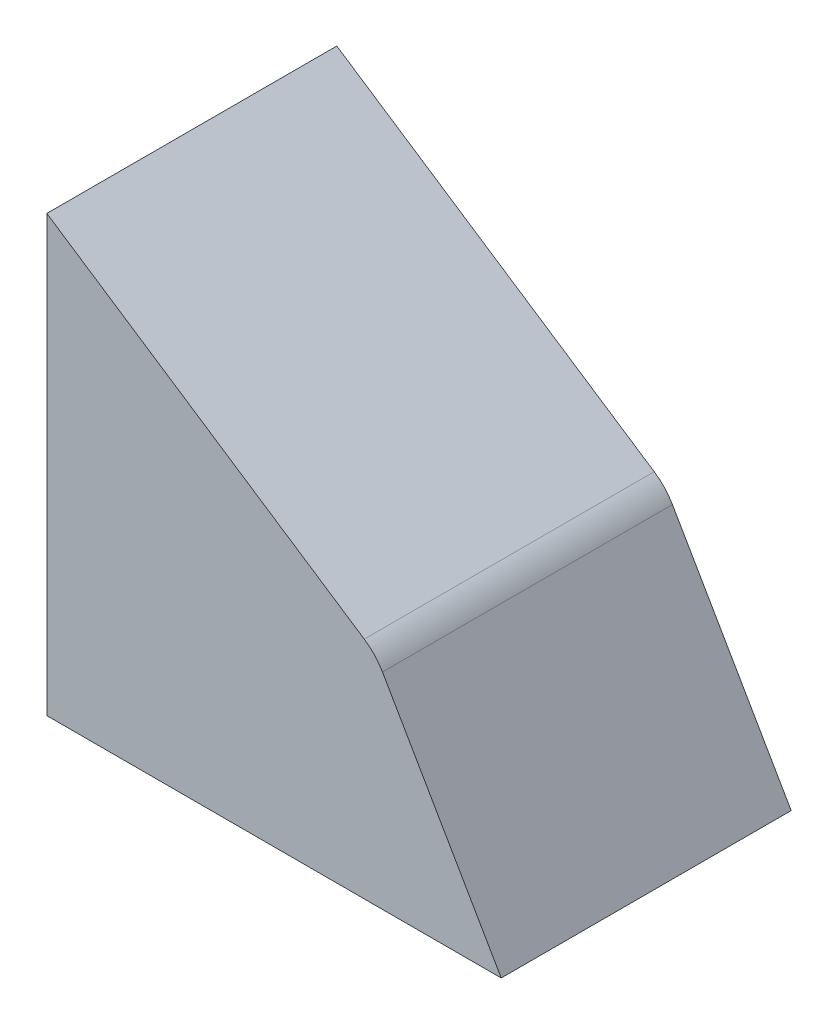
ISO-10303-21;
HEADER;
FILE_DESCRIPTION(('STEP AP214'),'2;1');
FILE_NAME('part.step','',(''),(''),'','','');
FILE_SCHEMA(('AUTOMOTIVE_DESIGN { 1 0 10303 214 1 1 1 1 }'));
ENDSEC;
DATA;
#1=APPLICATION_CONTEXT('core data for automotive mechanical design processes');
#2=APPLICATION_PROTOCOL_DEFINITION('international standard','automotive_design',2000,#1);
#3=PRODUCT_CONTEXT('',#1,'mechanical');
#4=PRODUCT('Part','Part','',(#3));
#5=PRODUCT_RELATED_PRODUCT_CATEGORY('part','',(#4));
#6=PRODUCT_DEFINITION_FORMATION('','',#4);
#7=PRODUCT_DEFINITION_CONTEXT('part definition',#1,'design');
#8=PRODUCT_DEFINITION('design','',#6,#7);
#9=PRODUCT_DEFINITION_SHAPE('','',#8);
#10=(LENGTH_UNIT() NAMED_UNIT(*) SI_UNIT(.MILLI.,.METRE.));
#11=(NAMED_UNIT(*) PLANE_ANGLE_UNIT() SI_UNIT($,.RADIAN.));
#12=(NAMED_UNIT(*) SI_UNIT($,.STERADIAN.) SOLID_ANGLE_UNIT());
#13=UNCERTAINTY_MEASURE_WITH_UNIT(LENGTH_MEASURE(1.E-05),#10,'distance_accuracy_value','');
#14=(GEOMETRIC_REPRESENTATION_CONTEXT(3) GLOBAL_UNCERTAINTY_ASSIGNED_CONTEXT((#13)) GLOBAL_UNIT_ASSIGNED_CONTEXT((#10,
#11,#12)) REPRESENTATION_CONTEXT('',''));
#15=CARTESIAN_POINT('',(0.,0.,0.));
#16=DIRECTION('',(0.,0.,1.));
#17=DIRECTION('',(1.,0.,0.));
#18=AXIS2_PLACEMENT_3D('',#15,#16,#17);
#19=CARTESIAN_POINT('',(-8.66025403784439,0.,10.));
#20=DIRECTION('',(-0.551645511654531,-0.834078671032542,0.));
#21=DIRECTION('',(0.834078671032542,-0.551645511654531,0.));
#22=AXIS2_PLACEMENT_3D('',#19,#20,#21);
#23=PLANE('',#22);
#24=DIRECTION('',(-0.834078671032542,0.551645511654531,0.));
#25=VECTOR('',#24,1.);
#26=CARTESIAN_POINT('',(-8.66025403784439,0.,10.));
#27=LINE('',#26,#25);
#28=CARTESIAN_POINT('',(-9.05336063391059,0.259994047148163,10.));
#29=VERTEX_POINT('',#28);
#30=CARTESIAN_POINT('',(-20.0001270189222,7.49999999999999,10.));
#31=VERTEX_POINT('',#30);
#32=EDGE_CURVE('E86',#29,#31,#27,.T.);
#33=ORIENTED_EDGE('',*,*,#32,.F.);
#34=DIRECTION('',(0.,0.,-1.));
#35=VECTOR('',#34,1.);
#36=CARTESIAN_POINT('',(-9.05336063391059,0.259994047148163,10.));
#37=LINE('',#36,#35);
#38=CARTESIAN_POINT('',(-9.05336063391059,0.259994047148163,0.));
#39=VERTEX_POINT('',#38);
#40=EDGE_CURVE('E112',#29,#39,#37,.T.);
#41=ORIENTED_EDGE('',*,*,#40,.T.);
#42=DIRECTION('',(-0.834078671032542,0.551645511654531,0.));
#43=VECTOR('',#42,1.);
#44=CARTESIAN_POINT('',(-8.66025403784439,0.,0.));
#45=LINE('',#44,#43);
#46=CARTESIAN_POINT('',(-20.0001270189222,7.49999999999999,0.));
#47=VERTEX_POINT('',#46);
#48=EDGE_CURVE('E109',#39,#47,#45,.T.);
#49=ORIENTED_EDGE('',*,*,#48,.T.);
#50=DIRECTION('',(0.,0.,-1.));
#51=VECTOR('',#50,1.);
#52=CARTESIAN_POINT('',(-20.0001270189222,7.49999999999999,10.));
#53=LINE('',#52,#51);
#54=EDGE_CURVE('E102',#31,#47,#53,.T.);
#55=ORIENTED_EDGE('',*,*,#54,.F.);
#56=EDGE_LOOP('',(#33,#41,#49,#55));
#57=FACE_BOUND('',#56,.T.);
#58=ADVANCED_FACE('F39',(#57),#23,.F.);
#59=CARTESIAN_POINT('',(-20.0001270189222,7.49999999999999,10.));
#60=DIRECTION('',(1.,0.,0.));
#61=DIRECTION('',(0.,1.,0.));
#62=AXIS2_PLACEMENT_3D('',#59,#60,#61);
#63=PLANE('',#62);
#64=DIRECTION('',(0.,-1.,0.));
#65=VECTOR('',#64,1.);
#66=CARTESIAN_POINT('',(-20.0001270189222,7.49999999999999,0.));
#67=LINE('',#66,#65);
#68=CARTESIAN_POINT('',(-20.0001270189222,-7.50000000000001,0.));
#69=VERTEX_POINT('',#68);
#70=EDGE_CURVE('E132',#47,#69,#67,.T.);
#71=ORIENTED_EDGE('',*,*,#70,.T.);
#72=DIRECTION('',(0.,0.,-1.));
#73=VECTOR('',#72,1.);
#74=CARTESIAN_POINT('',(-20.0001270189222,-7.50000000000001,10.));
#75=LINE('',#74,#73);
#76=CARTESIAN_POINT('',(-20.0001270189222,-7.50000000000001,10.));
#77=VERTEX_POINT('',#76);
#78=EDGE_CURVE('E104',#77,#69,#75,.T.);
#79=ORIENTED_EDGE('',*,*,#78,.F.);
#80=DIRECTION('',(0.,-1.,0.));
#81=VECTOR('',#80,1.);
#82=CARTESIAN_POINT('',(-20.0001270189222,7.49999999999999,10.));
#83=LINE('',#82,#81);
#84=EDGE_CURVE('E89',#31,#77,#83,.T.);
#85=ORIENTED_EDGE('',*,*,#84,.F.);
#86=ORIENTED_EDGE('',*,*,#54,.T.);
#87=EDGE_LOOP('',(#71,#79,#85,#86));
#88=FACE_BOUND('',#87,.T.);
#89=ADVANCED_FACE('F101',(#88),#63,.F.);
#90=CARTESIAN_POINT('',(-20.0001270189222,-7.50000000000001,10.));
#91=DIRECTION('',(0.,1.,0.));
#92=DIRECTION('',(-1.,0.,0.));
#93=AXIS2_PLACEMENT_3D('',#90,#91,#92);
#94=PLANE('',#93);
#95=DIRECTION('',(1.,0.,0.));
#96=VECTOR('',#95,1.);
#97=CARTESIAN_POINT('',(-20.0001270189222,-7.50000000000001,0.));
#98=LINE('',#97,#96);
#99=CARTESIAN_POINT('',(-4.33012701892219,-7.5,0.));
#100=VERTEX_POINT('',#99);
#101=EDGE_CURVE('E129',#69,#100,#98,.T.);
#102=ORIENTED_EDGE('',*,*,#101,.T.);
#103=DIRECTION('',(0.,0.,-1.));
#104=VECTOR('',#103,1.);
#105=CARTESIAN_POINT('',(-4.33012701892219,-7.5,10.));
#106=LINE('',#105,#104);
#107=CARTESIAN_POINT('',(-4.33012701892219,-7.5,10.));
#108=VERTEX_POINT('',#107);
#109=EDGE_CURVE('E117',#108,#100,#106,.T.);
#110=ORIENTED_EDGE('',*,*,#109,.F.);
#111=DIRECTION('',(1.,0.,0.));
#112=VECTOR('',#111,1.);
#113=CARTESIAN_POINT('',(-20.0001270189222,-7.50000000000001,10.));
#114=LINE('',#113,#112);
#115=EDGE_CURVE('E107',#77,#108,#114,.T.);
#116=ORIENTED_EDGE('',*,*,#115,.F.);
#117=ORIENTED_EDGE('',*,*,#78,.T.);
#118=EDGE_LOOP('',(#102,#110,#116,#117));
#119=FACE_BOUND('',#118,.T.);
#120=ADVANCED_FACE('F142',(#119),#94,.F.);
#121=CARTESIAN_POINT('',(-8.66025403784439,0.,10.));
#122=DIRECTION('',(-0.866025403784438,-0.5,0.));
#123=DIRECTION('',(0.5,-0.866025403784438,0.));
#124=AXIS2_PLACEMENT_3D('',#121,#122,#123);
#125=PLANE('',#124);
#126=DIRECTION('',(-0.5,0.866025403784438,0.));
#127=VECTOR('',#126,1.);
#128=CARTESIAN_POINT('',(-8.66025403784439,0.,0.));
#129=LINE('',#128,#127);
#130=CARTESIAN_POINT('',(-8.42460084965078,-0.408163294916919,0.));
#131=VERTEX_POINT('',#130);
#132=EDGE_CURVE('E97',#100,#131,#129,.T.);
#133=ORIENTED_EDGE('',*,*,#132,.T.);
#134=DIRECTION('',(0.,0.,-1.));
#135=VECTOR('',#134,1.);
#136=CARTESIAN_POINT('',(-8.42460084965078,-0.40816329491692,10.));
#137=LINE('',#136,#135);
#138=CARTESIAN_POINT('',(-8.42460084965078,-0.408163294916919,10.));
#139=VERTEX_POINT('',#138);
#140=EDGE_CURVE('E48',#131,#139,#137,.F.);
#141=ORIENTED_EDGE('',*,*,#140,.T.);
#142=DIRECTION('',(-0.5,0.866025403784438,0.));
#143=VECTOR('',#142,1.);
#144=CARTESIAN_POINT('',(-8.66025403784439,0.,10.));
#145=LINE('',#144,#143);
#146=EDGE_CURVE('E126',#108,#139,#145,.T.);
#147=ORIENTED_EDGE('',*,*,#146,.F.);
#148=ORIENTED_EDGE('',*,*,#109,.T.);
#149=EDGE_LOOP('',(#133,#141,#147,#148));
#150=FACE_BOUND('',#149,.T.);
#151=ADVANCED_FACE('F144',(#150),#125,.F.);
#152=CARTESIAN_POINT('',(0.,0.,10.));
#153=DIRECTION('',(0.,0.,1.));
#154=DIRECTION('',(1.,0.,0.));
#155=AXIS2_PLACEMENT_3D('',#152,#153,#154);
#156=PLANE('',#155);
#157=ORIENTED_EDGE('',*,*,#146,.T.);
#158=CARTESIAN_POINT('',(-10.1566516572197,-1.40816329491692,10.));
#159=DIRECTION('',(0.,0.,1.));
#160=DIRECTION('',(1.,0.,0.));
#161=AXIS2_PLACEMENT_3D('',#158,#159,#160);
#162=CIRCLE('',#161,2.);
#163=EDGE_CURVE('E11',#139,#29,#162,.T.);
#164=ORIENTED_EDGE('',*,*,#163,.T.);
#165=ORIENTED_EDGE('',*,*,#32,.T.);
#166=ORIENTED_EDGE('',*,*,#84,.T.);
#167=ORIENTED_EDGE('',*,*,#115,.T.);
#168=EDGE_LOOP('',(#157,#164,#165,#166,#167));
#169=FACE_BOUND('',#168,.T.);
#170=ADVANCED_FACE('F88',(#169),#156,.T.);
#171=CARTESIAN_POINT('',(0.,0.,0.));
#172=DIRECTION('',(0.,0.,1.));
#173=DIRECTION('',(1.,0.,0.));
#174=AXIS2_PLACEMENT_3D('',#171,#172,#173);
#175=PLANE('',#174);
#176=ORIENTED_EDGE('',*,*,#48,.F.);
#177=CARTESIAN_POINT('',(-10.1566516572197,-1.40816329491692,0.));
#178=DIRECTION('',(0.,0.,1.));
#179=DIRECTION('',(1.,0.,0.));
#180=AXIS2_PLACEMENT_3D('',#177,#178,#179);
#181=CIRCLE('',#180,2.);
#182=EDGE_CURVE('E62',#39,#131,#181,.F.);
#183=ORIENTED_EDGE('',*,*,#182,.T.);
#184=ORIENTED_EDGE('',*,*,#132,.F.);
#185=ORIENTED_EDGE('',*,*,#101,.F.);
#186=ORIENTED_EDGE('',*,*,#70,.F.);
#187=EDGE_LOOP('',(#176,#183,#184,#185,#186));
#188=FACE_BOUND('',#187,.T.);
#189=ADVANCED_FACE('F151',(#188),#175,.F.);
#190=CARTESIAN_POINT('',(-10.1566516572197,-1.40816329491692,10.));
#191=DIRECTION('',(0.,0.,-1.));
#192=DIRECTION('',(-1.,0.,0.));
#193=AXIS2_PLACEMENT_3D('',#190,#191,#192);
#194=CYLINDRICAL_SURFACE('',#193,2.);
#195=ORIENTED_EDGE('',*,*,#163,.F.);
#196=ORIENTED_EDGE('',*,*,#140,.F.);
#197=ORIENTED_EDGE('',*,*,#182,.F.);
#198=ORIENTED_EDGE('',*,*,#40,.F.);
#199=EDGE_LOOP('',(#195,#196,#197,#198));
#200=FACE_BOUND('',#199,.T.);
#201=ADVANCED_FACE('F41',(#200),#194,.T.);
#202=CLOSED_SHELL('',(#58,#89,#120,#151,#170,#189,#201));
#203=MANIFOLD_SOLID_BREP('B2',#202);
#204=ADVANCED_BREP_SHAPE_REPRESENTATION('',(#18,#203),#14);
#205=SHAPE_DEFINITION_REPRESENTATION(#9,#204);
ENDSEC;
END-ISO-10303-21;
